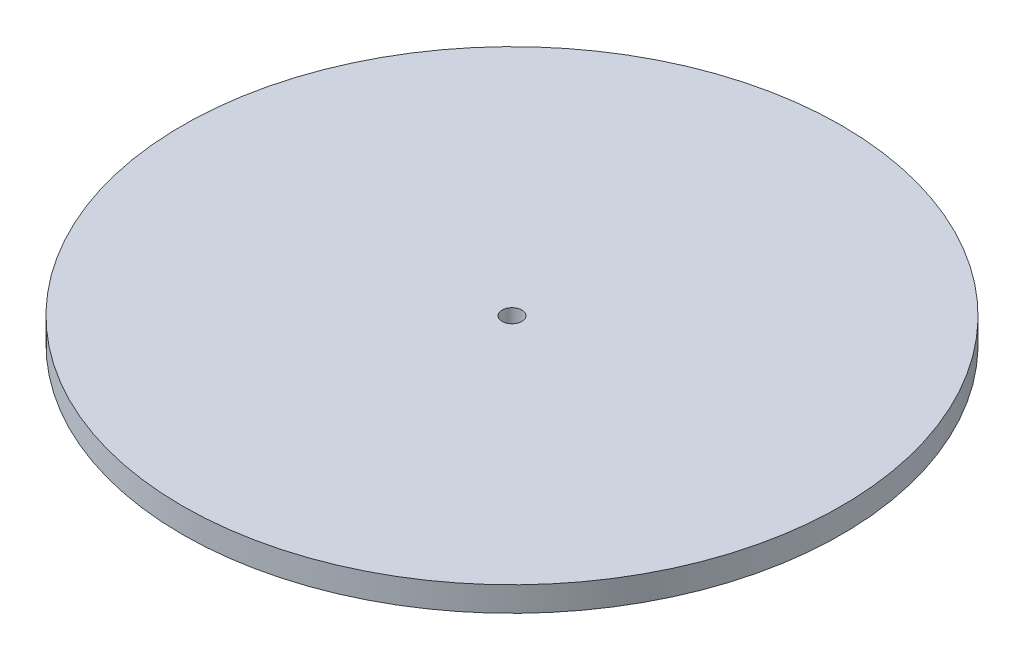
ISO-10303-21;
HEADER;
FILE_DESCRIPTION(('STEP AP214'),'2;1');
FILE_NAME('part.step','',(''),(''),'','','');
FILE_SCHEMA(('AUTOMOTIVE_DESIGN { 1 0 10303 214 1 1 1 1 }'));
ENDSEC;
DATA;
#1=APPLICATION_CONTEXT('core data for automotive mechanical design processes');
#2=APPLICATION_PROTOCOL_DEFINITION('international standard','automotive_design',2000,#1);
#3=PRODUCT_CONTEXT('',#1,'mechanical');
#4=PRODUCT('Part','Part','',(#3));
#5=PRODUCT_RELATED_PRODUCT_CATEGORY('part','',(#4));
#6=PRODUCT_DEFINITION_FORMATION('','',#4);
#7=PRODUCT_DEFINITION_CONTEXT('part definition',#1,'design');
#8=PRODUCT_DEFINITION('design','',#6,#7);
#9=PRODUCT_DEFINITION_SHAPE('','',#8);
#10=(LENGTH_UNIT() NAMED_UNIT(*) SI_UNIT(.MILLI.,.METRE.));
#11=(NAMED_UNIT(*) PLANE_ANGLE_UNIT() SI_UNIT($,.RADIAN.));
#12=(NAMED_UNIT(*) SI_UNIT($,.STERADIAN.) SOLID_ANGLE_UNIT());
#13=UNCERTAINTY_MEASURE_WITH_UNIT(LENGTH_MEASURE(1.E-05),#10,'distance_accuracy_value','');
#14=(GEOMETRIC_REPRESENTATION_CONTEXT(3) GLOBAL_UNCERTAINTY_ASSIGNED_CONTEXT((#13)) GLOBAL_UNIT_ASSIGNED_CONTEXT((#10,
#11,#12)) REPRESENTATION_CONTEXT('',''));
#15=CARTESIAN_POINT('',(0.,0.,0.));
#16=DIRECTION('',(0.,0.,1.));
#17=DIRECTION('',(1.,0.,0.));
#18=AXIS2_PLACEMENT_3D('',#15,#16,#17);
#19=CARTESIAN_POINT('',(0.,13.4028033732358,0.));
#20=DIRECTION('',(0.,1.,0.));
#21=DIRECTION('',(0.,0.,1.));
#22=AXIS2_PLACEMENT_3D('',#19,#20,#21);
#23=CYLINDRICAL_SURFACE('',#22,40.);
#24=CARTESIAN_POINT('',(0.,13.4028033732358,0.));
#25=DIRECTION('',(0.,1.,0.));
#26=DIRECTION('',(0.,0.,1.));
#27=AXIS2_PLACEMENT_3D('',#24,#25,#26);
#28=CIRCLE('',#27,40.);
#29=CARTESIAN_POINT('',(0.,13.4028033732358,40.));
#30=VERTEX_POINT('',#29);
#31=EDGE_CURVE('E50',#30,#30,#28,.T.);
#32=ORIENTED_EDGE('',*,*,#31,.F.);
#33=EDGE_LOOP('',(#32));
#34=FACE_BOUND('',#33,.T.);
#35=CARTESIAN_POINT('',(0.,10.4028033732358,0.));
#36=DIRECTION('',(0.,1.,0.));
#37=DIRECTION('',(0.,0.,1.));
#38=AXIS2_PLACEMENT_3D('',#35,#36,#37);
#39=CIRCLE('',#38,40.);
#40=CARTESIAN_POINT('',(0.,10.4028033732358,40.));
#41=VERTEX_POINT('',#40);
#42=EDGE_CURVE('E10',#41,#41,#39,.T.);
#43=ORIENTED_EDGE('',*,*,#42,.T.);
#44=EDGE_LOOP('',(#43));
#45=FACE_BOUND('',#44,.T.);
#46=ADVANCED_FACE('F31',(#34,#45),#23,.T.);
#47=CARTESIAN_POINT('',(37.,10.4028033732358,0.));
#48=DIRECTION('',(0.,1.,0.));
#49=DIRECTION('',(0.,0.,1.));
#50=AXIS2_PLACEMENT_3D('',#47,#48,#49);
#51=PLANE('',#50);
#52=ORIENTED_EDGE('',*,*,#42,.F.);
#53=EDGE_LOOP('',(#52));
#54=FACE_BOUND('',#53,.T.);
#55=CARTESIAN_POINT('',(0.,10.4028033732358,0.));
#56=DIRECTION('',(0.,1.,0.));
#57=DIRECTION('',(0.,0.,1.));
#58=AXIS2_PLACEMENT_3D('',#55,#56,#57);
#59=CIRCLE('',#58,37.);
#60=CARTESIAN_POINT('',(0.,10.4028033732358,37.));
#61=VERTEX_POINT('',#60);
#62=EDGE_CURVE('E37',#61,#61,#59,.T.);
#63=ORIENTED_EDGE('',*,*,#62,.T.);
#64=EDGE_LOOP('',(#63));
#65=FACE_BOUND('',#64,.T.);
#66=ADVANCED_FACE('F71',(#54,#65),#51,.F.);
#67=CARTESIAN_POINT('',(0.,13.4028033732358,0.));
#68=DIRECTION('',(0.,1.,0.));
#69=DIRECTION('',(0.,0.,1.));
#70=AXIS2_PLACEMENT_3D('',#67,#68,#69);
#71=CYLINDRICAL_SURFACE('',#70,37.0000000000002);
#72=ORIENTED_EDGE('',*,*,#62,.F.);
#73=EDGE_LOOP('',(#72));
#74=FACE_BOUND('',#73,.T.);
#75=CARTESIAN_POINT('',(0.,9.4028033732359,0.));
#76=DIRECTION('',(0.,1.,0.));
#77=DIRECTION('',(0.,0.,1.));
#78=AXIS2_PLACEMENT_3D('',#75,#76,#77);
#79=CIRCLE('',#78,37.0000000000003);
#80=CARTESIAN_POINT('',(0.,9.4028033732359,37.0000000000003));
#81=VERTEX_POINT('',#80);
#82=EDGE_CURVE('E41',#81,#81,#79,.T.);
#83=ORIENTED_EDGE('',*,*,#82,.T.);
#84=EDGE_LOOP('',(#83));
#85=FACE_BOUND('',#84,.T.);
#86=ADVANCED_FACE('F67',(#74,#85),#71,.T.);
#87=CARTESIAN_POINT('',(1.82525489948043E-10,0.,0.));
#88=CARTESIAN_POINT('',(4.62500000916677,0.00113064159279161,0.));
#89=CARTESIAN_POINT('',(9.2500000139787,0.546194692012633,0.));
#90=CARTESIAN_POINT('',(13.8750000143067,1.67581201565711,0.));
#91=CARTESIAN_POINT('',(18.5000000128134,3.04287660400677,0.));
#92=CARTESIAN_POINT('',(23.1250000102574,4.54847888569906,0.));
#93=CARTESIAN_POINT('',(27.7500000070458,6.1395448995897,0.));
#94=CARTESIAN_POINT('',(32.3750000035844,7.76317966232675,0.));
#95=CARTESIAN_POINT('',(37.0000000000003,9.4028033732359,0.));
#96=B_SPLINE_CURVE_WITH_KNOTS('',8,(#87,#88,#89,#90,#91,#92,#93,#94,#95),.UNSPECIFIED.,.F.,.F.,
(9,9),(0.0835045223789907,0.918549747668992),.UNSPECIFIED.);
#97=CARTESIAN_POINT('',(0.,13.4028033732358,0.));
#98=DIRECTION('',(0.,1.,0.));
#99=AXIS1_PLACEMENT('',#97,#98);
#100=SURFACE_OF_REVOLUTION('',#96,#99);
#101=CARTESIAN_POINT('',(0.,0.0163621890366568,0.));
#102=DIRECTION('',(0.,1.,0.));
#103=DIRECTION('',(0.,0.,1.));
#104=AXIS2_PLACEMENT_3D('',#101,#102,#103);
#105=CIRCLE('',#104,1.20000000000492);
#106=CARTESIAN_POINT('',(0.,0.0163621890366568,1.20000000000492));
#107=VERTEX_POINT('',#106);
#108=EDGE_CURVE('E53',#107,#107,#105,.T.);
#109=ORIENTED_EDGE('',*,*,#108,.T.);
#110=EDGE_LOOP('',(#109));
#111=FACE_BOUND('',#110,.T.);
#112=ORIENTED_EDGE('',*,*,#82,.F.);
#113=EDGE_LOOP('',(#112));
#114=FACE_BOUND('',#113,.T.);
#115=ADVANCED_FACE('F62',(#111,#114),#100,.T.);
#116=CARTESIAN_POINT('',(0.,13.4028033732358,0.));
#117=DIRECTION('',(0.,1.,0.));
#118=DIRECTION('',(0.,0.,1.));
#119=AXIS2_PLACEMENT_3D('',#116,#117,#118);
#120=CYLINDRICAL_SURFACE('',#119,1.2);
#121=CARTESIAN_POINT('',(0.,13.4028033732358,0.));
#122=DIRECTION('',(0.,1.,0.));
#123=DIRECTION('',(0.,0.,1.));
#124=AXIS2_PLACEMENT_3D('',#121,#122,#123);
#125=CIRCLE('',#124,1.2);
#126=CARTESIAN_POINT('',(0.,13.4028033732358,1.2));
#127=VERTEX_POINT('',#126);
#128=EDGE_CURVE('E45',#127,#127,#125,.T.);
#129=ORIENTED_EDGE('',*,*,#128,.T.);
#130=EDGE_LOOP('',(#129));
#131=FACE_BOUND('',#130,.T.);
#132=ORIENTED_EDGE('',*,*,#108,.F.);
#133=EDGE_LOOP('',(#132));
#134=FACE_BOUND('',#133,.T.);
#135=ADVANCED_FACE('F66',(#131,#134),#120,.F.);
#136=CARTESIAN_POINT('',(40.,13.4028033732358,0.));
#137=DIRECTION('',(0.,-1.,0.));
#138=DIRECTION('',(0.,0.,-1.));
#139=AXIS2_PLACEMENT_3D('',#136,#137,#138);
#140=PLANE('',#139);
#141=ORIENTED_EDGE('',*,*,#128,.F.);
#142=EDGE_LOOP('',(#141));
#143=FACE_BOUND('',#142,.T.);
#144=ORIENTED_EDGE('',*,*,#31,.T.);
#145=EDGE_LOOP('',(#144));
#146=FACE_BOUND('',#145,.T.);
#147=ADVANCED_FACE('F83',(#143,#146),#140,.F.);
#148=CLOSED_SHELL('',(#46,#66,#86,#115,#135,#147));
#149=MANIFOLD_SOLID_BREP('B2',#148);
#150=ADVANCED_BREP_SHAPE_REPRESENTATION('',(#18,#149),#14);
#151=SHAPE_DEFINITION_REPRESENTATION(#9,#150);
ENDSEC;
END-ISO-10303-21;
